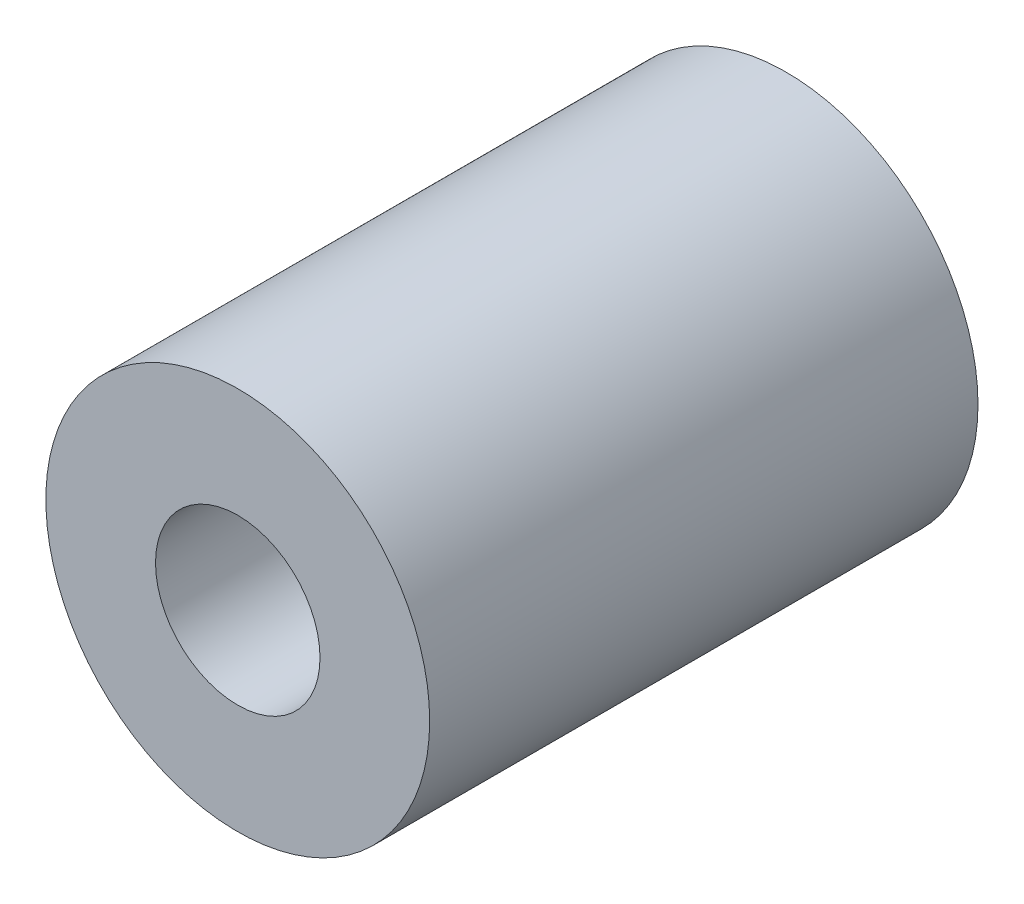
ISO-10303-21;
HEADER;
FILE_DESCRIPTION(('STEP AP214'),'2;1');
FILE_NAME('part.step','',(''),(''),'','','');
FILE_SCHEMA(('AUTOMOTIVE_DESIGN { 1 0 10303 214 1 1 1 1 }'));
ENDSEC;
DATA;
#1=APPLICATION_CONTEXT('core data for automotive mechanical design processes');
#2=APPLICATION_PROTOCOL_DEFINITION('international standard','automotive_design',2000,#1);
#3=PRODUCT_CONTEXT('',#1,'mechanical');
#4=PRODUCT('Part','Part','',(#3));
#5=PRODUCT_RELATED_PRODUCT_CATEGORY('part','',(#4));
#6=PRODUCT_DEFINITION_FORMATION('','',#4);
#7=PRODUCT_DEFINITION_CONTEXT('part definition',#1,'design');
#8=PRODUCT_DEFINITION('design','',#6,#7);
#9=PRODUCT_DEFINITION_SHAPE('','',#8);
#10=(LENGTH_UNIT() NAMED_UNIT(*) SI_UNIT(.MILLI.,.METRE.));
#11=(NAMED_UNIT(*) PLANE_ANGLE_UNIT() SI_UNIT($,.RADIAN.));
#12=(NAMED_UNIT(*) SI_UNIT($,.STERADIAN.) SOLID_ANGLE_UNIT());
#13=UNCERTAINTY_MEASURE_WITH_UNIT(LENGTH_MEASURE(1.E-05),#10,'distance_accuracy_value','');
#14=(GEOMETRIC_REPRESENTATION_CONTEXT(3) GLOBAL_UNCERTAINTY_ASSIGNED_CONTEXT((#13)) GLOBAL_UNIT_ASSIGNED_CONTEXT((#10,
#11,#12)) REPRESENTATION_CONTEXT('',''));
#15=CARTESIAN_POINT('',(0.,0.,0.));
#16=DIRECTION('',(0.,0.,1.));
#17=DIRECTION('',(1.,0.,0.));
#18=AXIS2_PLACEMENT_3D('',#15,#16,#17);
#19=CARTESIAN_POINT('',(0.,0.,10.));
#20=DIRECTION('',(0.,0.,1.));
#21=DIRECTION('',(1.,0.,0.));
#22=AXIS2_PLACEMENT_3D('',#19,#20,#21);
#23=PLANE('',#22);
#24=CARTESIAN_POINT('',(0.,0.,10.));
#25=DIRECTION('',(0.,0.,1.));
#26=DIRECTION('',(1.,0.,0.));
#27=AXIS2_PLACEMENT_3D('',#24,#25,#26);
#28=CIRCLE('',#27,3.5);
#29=CARTESIAN_POINT('',(3.5,0.,10.));
#30=VERTEX_POINT('',#29);
#31=EDGE_CURVE('E10',#30,#30,#28,.T.);
#32=ORIENTED_EDGE('',*,*,#31,.T.);
#33=EDGE_LOOP('',(#32));
#34=FACE_BOUND('',#33,.T.);
#35=CARTESIAN_POINT('',(0.,0.,10.));
#36=DIRECTION('',(0.,0.,1.));
#37=DIRECTION('',(1.,0.,0.));
#38=AXIS2_PLACEMENT_3D('',#35,#36,#37);
#39=CIRCLE('',#38,1.5);
#40=CARTESIAN_POINT('',(1.5,0.,10.));
#41=VERTEX_POINT('',#40);
#42=EDGE_CURVE('E43',#41,#41,#39,.T.);
#43=ORIENTED_EDGE('',*,*,#42,.F.);
#44=EDGE_LOOP('',(#43));
#45=FACE_BOUND('',#44,.T.);
#46=ADVANCED_FACE('F32',(#34,#45),#23,.T.);
#47=CARTESIAN_POINT('',(0.,0.,0.));
#48=DIRECTION('',(0.,0.,1.));
#49=DIRECTION('',(1.,0.,0.));
#50=AXIS2_PLACEMENT_3D('',#47,#48,#49);
#51=PLANE('',#50);
#52=CARTESIAN_POINT('',(0.,0.,0.));
#53=DIRECTION('',(0.,0.,1.));
#54=DIRECTION('',(1.,0.,0.));
#55=AXIS2_PLACEMENT_3D('',#52,#53,#54);
#56=CIRCLE('',#55,3.5);
#57=CARTESIAN_POINT('',(3.5,0.,0.));
#58=VERTEX_POINT('',#57);
#59=EDGE_CURVE('E36',#58,#58,#56,.T.);
#60=ORIENTED_EDGE('',*,*,#59,.F.);
#61=EDGE_LOOP('',(#60));
#62=FACE_BOUND('',#61,.T.);
#63=CARTESIAN_POINT('',(0.,0.,0.));
#64=DIRECTION('',(0.,0.,1.));
#65=DIRECTION('',(1.,0.,0.));
#66=AXIS2_PLACEMENT_3D('',#63,#64,#65);
#67=CIRCLE('',#66,1.5);
#68=CARTESIAN_POINT('',(1.5,0.,0.));
#69=VERTEX_POINT('',#68);
#70=EDGE_CURVE('E45',#69,#69,#67,.T.);
#71=ORIENTED_EDGE('',*,*,#70,.T.);
#72=EDGE_LOOP('',(#71));
#73=FACE_BOUND('',#72,.T.);
#74=ADVANCED_FACE('F55',(#62,#73),#51,.F.);
#75=CARTESIAN_POINT('',(0.,0.,10.));
#76=DIRECTION('',(0.,0.,-1.));
#77=DIRECTION('',(-1.,0.,0.));
#78=AXIS2_PLACEMENT_3D('',#75,#76,#77);
#79=CYLINDRICAL_SURFACE('',#78,3.5);
#80=ORIENTED_EDGE('',*,*,#31,.F.);
#81=EDGE_LOOP('',(#80));
#82=FACE_BOUND('',#81,.T.);
#83=ORIENTED_EDGE('',*,*,#59,.T.);
#84=EDGE_LOOP('',(#83));
#85=FACE_BOUND('',#84,.T.);
#86=ADVANCED_FACE('F34',(#82,#85),#79,.T.);
#87=CARTESIAN_POINT('',(0.,0.,10.));
#88=DIRECTION('',(0.,0.,-1.));
#89=DIRECTION('',(-1.,0.,0.));
#90=AXIS2_PLACEMENT_3D('',#87,#88,#89);
#91=CYLINDRICAL_SURFACE('',#90,1.5);
#92=ORIENTED_EDGE('',*,*,#42,.T.);
#93=EDGE_LOOP('',(#92));
#94=FACE_BOUND('',#93,.T.);
#95=ORIENTED_EDGE('',*,*,#70,.F.);
#96=EDGE_LOOP('',(#95));
#97=FACE_BOUND('',#96,.T.);
#98=ADVANCED_FACE('F51',(#94,#97),#91,.F.);
#99=CLOSED_SHELL('',(#46,#74,#86,#98));
#100=MANIFOLD_SOLID_BREP('B2',#99);
#101=ADVANCED_BREP_SHAPE_REPRESENTATION('',(#18,#100),#14);
#102=SHAPE_DEFINITION_REPRESENTATION(#9,#101);
ENDSEC;
END-ISO-10303-21;
